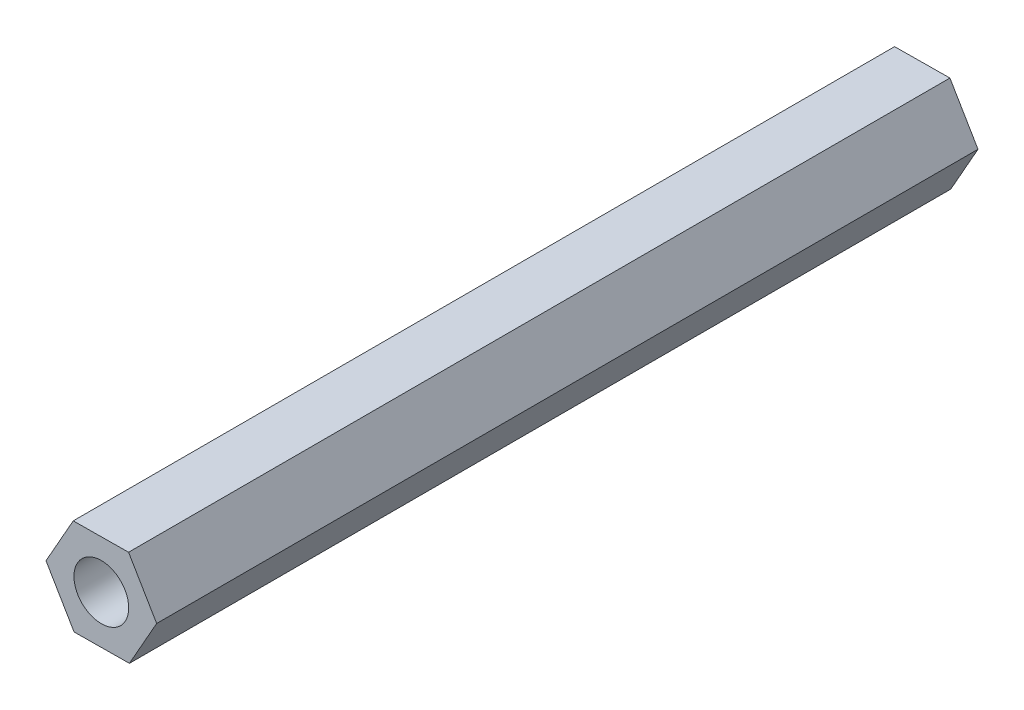
ISO-10303-21;
HEADER;
FILE_DESCRIPTION(('STEP AP214'),'2;1');
FILE_NAME('part.step','',(''),(''),'','','');
FILE_SCHEMA(('AUTOMOTIVE_DESIGN { 1 0 10303 214 1 1 1 1 }'));
ENDSEC;
DATA;
#1=APPLICATION_CONTEXT('core data for automotive mechanical design processes');
#2=APPLICATION_PROTOCOL_DEFINITION('international standard','automotive_design',2000,#1);
#3=PRODUCT_CONTEXT('',#1,'mechanical');
#4=PRODUCT('Part','Part','',(#3));
#5=PRODUCT_RELATED_PRODUCT_CATEGORY('part','',(#4));
#6=PRODUCT_DEFINITION_FORMATION('','',#4);
#7=PRODUCT_DEFINITION_CONTEXT('part definition',#1,'design');
#8=PRODUCT_DEFINITION('design','',#6,#7);
#9=PRODUCT_DEFINITION_SHAPE('','',#8);
#10=(LENGTH_UNIT() NAMED_UNIT(*) SI_UNIT(.MILLI.,.METRE.));
#11=(NAMED_UNIT(*) PLANE_ANGLE_UNIT() SI_UNIT($,.RADIAN.));
#12=(NAMED_UNIT(*) SI_UNIT($,.STERADIAN.) SOLID_ANGLE_UNIT());
#13=UNCERTAINTY_MEASURE_WITH_UNIT(LENGTH_MEASURE(1.E-05),#10,'distance_accuracy_value','');
#14=(GEOMETRIC_REPRESENTATION_CONTEXT(3) GLOBAL_UNCERTAINTY_ASSIGNED_CONTEXT((#13)) GLOBAL_UNIT_ASSIGNED_CONTEXT((#10,
#11,#12)) REPRESENTATION_CONTEXT('',''));
#15=CARTESIAN_POINT('',(0.,0.,0.));
#16=DIRECTION('',(0.,0.,1.));
#17=DIRECTION('',(1.,0.,0.));
#18=AXIS2_PLACEMENT_3D('',#15,#16,#17);
#19=CARTESIAN_POINT('',(0.,0.,60.));
#20=DIRECTION('',(0.,0.,1.));
#21=DIRECTION('',(1.,0.,0.));
#22=AXIS2_PLACEMENT_3D('',#19,#20,#21);
#23=PLANE('',#22);
#24=DIRECTION('',(0.999961257640527,0.00880245522430722,0.));
#25=VECTOR('',#24,1.);
#26=CARTESIAN_POINT('',(-1.98983906118775,-3.51765175136834,60.));
#27=LINE('',#26,#25);
#28=CARTESIAN_POINT('',(-1.98983906118775,-3.51765175136834,60.));
#29=VERTEX_POINT('',#28);
#30=CARTESIAN_POINT('',(2.05145624775792,-3.48207705211536,60.));
#31=VERTEX_POINT('',#30);
#32=EDGE_CURVE('E146',#29,#31,#27,.T.);
#33=ORIENTED_EDGE('',*,*,#32,.T.);
#34=DIRECTION('',(0.492357478980338,0.870393079529086,0.));
#35=VECTOR('',#34,1.);
#36=CARTESIAN_POINT('',(2.05145624775792,-3.48207705211536,60.));
#37=LINE('',#36,#35);
#38=CARTESIAN_POINT('',(4.04129530894568,0.0355746992529791,60.));
#39=VERTEX_POINT('',#38);
#40=EDGE_CURVE('E94',#31,#39,#37,.T.);
#41=ORIENTED_EDGE('',*,*,#40,.T.);
#42=DIRECTION('',(-0.507603778660189,0.861590624304779,0.));
#43=VECTOR('',#42,1.);
#44=CARTESIAN_POINT('',(4.04129530894568,0.0355746992529791,60.));
#45=LINE('',#44,#43);
#46=CARTESIAN_POINT('',(1.98983906118776,3.51765175136834,60.));
#47=VERTEX_POINT('',#46);
#48=EDGE_CURVE('E107',#39,#47,#45,.T.);
#49=ORIENTED_EDGE('',*,*,#48,.T.);
#50=DIRECTION('',(-0.999961257640527,-0.00880245522430723,0.));
#51=VECTOR('',#50,1.);
#52=CARTESIAN_POINT('',(1.98983906118776,3.51765175136834,60.));
#53=LINE('',#52,#51);
#54=CARTESIAN_POINT('',(-2.05145624775791,3.48207705211536,60.));
#55=VERTEX_POINT('',#54);
#56=EDGE_CURVE('E101',#47,#55,#53,.T.);
#57=ORIENTED_EDGE('',*,*,#56,.T.);
#58=DIRECTION('',(-0.492357478980338,-0.870393079529086,0.));
#59=VECTOR('',#58,1.);
#60=CARTESIAN_POINT('',(-2.05145624775791,3.48207705211536,60.));
#61=LINE('',#60,#59);
#62=CARTESIAN_POINT('',(-4.04129530894568,-0.0355746992529825,60.));
#63=VERTEX_POINT('',#62);
#64=EDGE_CURVE('E105',#55,#63,#61,.T.);
#65=ORIENTED_EDGE('',*,*,#64,.T.);
#66=DIRECTION('',(0.507603778660189,-0.861590624304779,0.));
#67=VECTOR('',#66,1.);
#68=CARTESIAN_POINT('',(-4.04129530894568,-0.0355746992529825,60.));
#69=LINE('',#68,#67);
#70=EDGE_CURVE('E57',#63,#29,#69,.T.);
#71=ORIENTED_EDGE('',*,*,#70,.T.);
#72=EDGE_LOOP('',(#33,#41,#49,#57,#65,#71));
#73=FACE_BOUND('',#72,.T.);
#74=CARTESIAN_POINT('',(0.,0.,60.));
#75=DIRECTION('',(0.,0.,1.));
#76=DIRECTION('',(1.,0.,0.));
#77=AXIS2_PLACEMENT_3D('',#74,#75,#76);
#78=CIRCLE('',#77,2.);
#79=CARTESIAN_POINT('',(2.,0.,60.));
#80=VERTEX_POINT('',#79);
#81=EDGE_CURVE('E134',#80,#80,#78,.T.);
#82=ORIENTED_EDGE('',*,*,#81,.F.);
#83=EDGE_LOOP('',(#82));
#84=FACE_BOUND('',#83,.T.);
#85=ADVANCED_FACE('F39',(#73,#84),#23,.T.);
#86=CARTESIAN_POINT('',(0.,0.,0.));
#87=DIRECTION('',(0.,0.,1.));
#88=DIRECTION('',(1.,0.,0.));
#89=AXIS2_PLACEMENT_3D('',#86,#87,#88);
#90=PLANE('',#89);
#91=DIRECTION('',(0.999961257640527,0.00880245522430722,0.));
#92=VECTOR('',#91,1.);
#93=CARTESIAN_POINT('',(-1.98983906118775,-3.51765175136834,0.));
#94=LINE('',#93,#92);
#95=CARTESIAN_POINT('',(-1.98983906118775,-3.51765175136834,0.));
#96=VERTEX_POINT('',#95);
#97=CARTESIAN_POINT('',(2.05145624775792,-3.48207705211536,0.));
#98=VERTEX_POINT('',#97);
#99=EDGE_CURVE('E129',#96,#98,#94,.T.);
#100=ORIENTED_EDGE('',*,*,#99,.F.);
#101=DIRECTION('',(0.507603778660189,-0.861590624304779,0.));
#102=VECTOR('',#101,1.);
#103=CARTESIAN_POINT('',(-4.04129530894568,-0.0355746992529825,0.));
#104=LINE('',#103,#102);
#105=CARTESIAN_POINT('',(-4.04129530894568,-0.0355746992529825,0.));
#106=VERTEX_POINT('',#105);
#107=EDGE_CURVE('E86',#106,#96,#104,.T.);
#108=ORIENTED_EDGE('',*,*,#107,.F.);
#109=DIRECTION('',(-0.492357478980338,-0.870393079529086,0.));
#110=VECTOR('',#109,1.);
#111=CARTESIAN_POINT('',(-2.05145624775791,3.48207705211536,0.));
#112=LINE('',#111,#110);
#113=CARTESIAN_POINT('',(-2.05145624775791,3.48207705211536,0.));
#114=VERTEX_POINT('',#113);
#115=EDGE_CURVE('E80',#114,#106,#112,.T.);
#116=ORIENTED_EDGE('',*,*,#115,.F.);
#117=DIRECTION('',(-0.999961257640527,-0.00880245522430723,0.));
#118=VECTOR('',#117,1.);
#119=CARTESIAN_POINT('',(1.98983906118776,3.51765175136834,0.));
#120=LINE('',#119,#118);
#121=CARTESIAN_POINT('',(1.98983906118776,3.51765175136834,0.));
#122=VERTEX_POINT('',#121);
#123=EDGE_CURVE('E116',#122,#114,#120,.T.);
#124=ORIENTED_EDGE('',*,*,#123,.F.);
#125=DIRECTION('',(-0.507603778660189,0.861590624304779,0.));
#126=VECTOR('',#125,1.);
#127=CARTESIAN_POINT('',(4.04129530894568,0.0355746992529791,0.));
#128=LINE('',#127,#126);
#129=CARTESIAN_POINT('',(4.04129530894568,0.0355746992529791,0.));
#130=VERTEX_POINT('',#129);
#131=EDGE_CURVE('E137',#130,#122,#128,.T.);
#132=ORIENTED_EDGE('',*,*,#131,.F.);
#133=DIRECTION('',(0.492357478980338,0.870393079529086,0.));
#134=VECTOR('',#133,1.);
#135=CARTESIAN_POINT('',(2.05145624775792,-3.48207705211536,0.));
#136=LINE('',#135,#134);
#137=EDGE_CURVE('E133',#98,#130,#136,.T.);
#138=ORIENTED_EDGE('',*,*,#137,.F.);
#139=EDGE_LOOP('',(#100,#108,#116,#124,#132,#138));
#140=FACE_BOUND('',#139,.T.);
#141=CARTESIAN_POINT('',(0.,0.,0.));
#142=DIRECTION('',(0.,0.,1.));
#143=DIRECTION('',(1.,0.,0.));
#144=AXIS2_PLACEMENT_3D('',#141,#142,#143);
#145=CIRCLE('',#144,2.);
#146=CARTESIAN_POINT('',(2.,0.,0.));
#147=VERTEX_POINT('',#146);
#148=EDGE_CURVE('E243',#147,#147,#145,.T.);
#149=ORIENTED_EDGE('',*,*,#148,.T.);
#150=EDGE_LOOP('',(#149));
#151=FACE_BOUND('',#150,.T.);
#152=ADVANCED_FACE('F159',(#140,#151),#90,.F.);
#153=CARTESIAN_POINT('',(-1.98983906118775,-3.51765175136834,60.));
#154=DIRECTION('',(-0.00880245522430722,0.999961257640527,0.));
#155=DIRECTION('',(-0.999961257640527,-0.00880245522430722,0.));
#156=AXIS2_PLACEMENT_3D('',#153,#154,#155);
#157=PLANE('',#156);
#158=ORIENTED_EDGE('',*,*,#99,.T.);
#159=DIRECTION('',(0.,0.,-1.));
#160=VECTOR('',#159,1.);
#161=CARTESIAN_POINT('',(2.05145624775792,-3.48207705211536,60.));
#162=LINE('',#161,#160);
#163=EDGE_CURVE('E11',#31,#98,#162,.T.);
#164=ORIENTED_EDGE('',*,*,#163,.F.);
#165=ORIENTED_EDGE('',*,*,#32,.F.);
#166=DIRECTION('',(0.,0.,-1.));
#167=VECTOR('',#166,1.);
#168=CARTESIAN_POINT('',(-1.98983906118775,-3.51765175136834,60.));
#169=LINE('',#168,#167);
#170=EDGE_CURVE('E125',#29,#96,#169,.T.);
#171=ORIENTED_EDGE('',*,*,#170,.T.);
#172=EDGE_LOOP('',(#158,#164,#165,#171));
#173=FACE_BOUND('',#172,.T.);
#174=ADVANCED_FACE('F41',(#173),#157,.F.);
#175=CARTESIAN_POINT('',(2.05145624775792,-3.48207705211536,60.));
#176=DIRECTION('',(-0.870393079529086,0.492357478980338,0.));
#177=DIRECTION('',(-0.492357478980338,-0.870393079529086,0.));
#178=AXIS2_PLACEMENT_3D('',#175,#176,#177);
#179=PLANE('',#178);
#180=ORIENTED_EDGE('',*,*,#137,.T.);
#181=DIRECTION('',(0.,0.,-1.));
#182=VECTOR('',#181,1.);
#183=CARTESIAN_POINT('',(4.04129530894568,0.0355746992529791,60.));
#184=LINE('',#183,#182);
#185=EDGE_CURVE('E49',#39,#130,#184,.T.);
#186=ORIENTED_EDGE('',*,*,#185,.F.);
#187=ORIENTED_EDGE('',*,*,#40,.F.);
#188=ORIENTED_EDGE('',*,*,#163,.T.);
#189=EDGE_LOOP('',(#180,#186,#187,#188));
#190=FACE_BOUND('',#189,.T.);
#191=ADVANCED_FACE('F184',(#190),#179,.F.);
#192=CARTESIAN_POINT('',(4.04129530894568,0.0355746992529791,60.));
#193=DIRECTION('',(-0.861590624304779,-0.507603778660189,0.));
#194=DIRECTION('',(0.507603778660189,-0.861590624304779,0.));
#195=AXIS2_PLACEMENT_3D('',#192,#193,#194);
#196=PLANE('',#195);
#197=ORIENTED_EDGE('',*,*,#131,.T.);
#198=DIRECTION('',(0.,0.,-1.));
#199=VECTOR('',#198,1.);
#200=CARTESIAN_POINT('',(1.98983906118776,3.51765175136834,60.));
#201=LINE('',#200,#199);
#202=EDGE_CURVE('E118',#47,#122,#201,.T.);
#203=ORIENTED_EDGE('',*,*,#202,.F.);
#204=ORIENTED_EDGE('',*,*,#48,.F.);
#205=ORIENTED_EDGE('',*,*,#185,.T.);
#206=EDGE_LOOP('',(#197,#203,#204,#205));
#207=FACE_BOUND('',#206,.T.);
#208=ADVANCED_FACE('F156',(#207),#196,.F.);
#209=CARTESIAN_POINT('',(1.98983906118776,3.51765175136834,60.));
#210=DIRECTION('',(0.00880245522430723,-0.999961257640527,0.));
#211=DIRECTION('',(0.999961257640527,0.00880245522430723,0.));
#212=AXIS2_PLACEMENT_3D('',#209,#210,#211);
#213=PLANE('',#212);
#214=ORIENTED_EDGE('',*,*,#123,.T.);
#215=DIRECTION('',(0.,0.,-1.));
#216=VECTOR('',#215,1.);
#217=CARTESIAN_POINT('',(-2.05145624775791,3.48207705211536,60.));
#218=LINE('',#217,#216);
#219=EDGE_CURVE('E113',#55,#114,#218,.T.);
#220=ORIENTED_EDGE('',*,*,#219,.F.);
#221=ORIENTED_EDGE('',*,*,#56,.F.);
#222=ORIENTED_EDGE('',*,*,#202,.T.);
#223=EDGE_LOOP('',(#214,#220,#221,#222));
#224=FACE_BOUND('',#223,.T.);
#225=ADVANCED_FACE('F114',(#224),#213,.F.);
#226=CARTESIAN_POINT('',(-2.05145624775791,3.48207705211536,60.));
#227=DIRECTION('',(0.870393079529086,-0.492357478980338,0.));
#228=DIRECTION('',(0.492357478980338,0.870393079529086,0.));
#229=AXIS2_PLACEMENT_3D('',#226,#227,#228);
#230=PLANE('',#229);
#231=ORIENTED_EDGE('',*,*,#115,.T.);
#232=DIRECTION('',(0.,0.,-1.));
#233=VECTOR('',#232,1.);
#234=CARTESIAN_POINT('',(-4.04129530894568,-0.0355746992529825,60.));
#235=LINE('',#234,#233);
#236=EDGE_CURVE('E119',#63,#106,#235,.T.);
#237=ORIENTED_EDGE('',*,*,#236,.F.);
#238=ORIENTED_EDGE('',*,*,#64,.F.);
#239=ORIENTED_EDGE('',*,*,#219,.T.);
#240=EDGE_LOOP('',(#231,#237,#238,#239));
#241=FACE_BOUND('',#240,.T.);
#242=ADVANCED_FACE('F121',(#241),#230,.F.);
#243=CARTESIAN_POINT('',(-4.04129530894568,-0.0355746992529825,60.));
#244=DIRECTION('',(0.861590624304779,0.507603778660189,0.));
#245=DIRECTION('',(-0.507603778660189,0.861590624304779,0.));
#246=AXIS2_PLACEMENT_3D('',#243,#244,#245);
#247=PLANE('',#246);
#248=ORIENTED_EDGE('',*,*,#107,.T.);
#249=ORIENTED_EDGE('',*,*,#170,.F.);
#250=ORIENTED_EDGE('',*,*,#70,.F.);
#251=ORIENTED_EDGE('',*,*,#236,.T.);
#252=EDGE_LOOP('',(#248,#249,#250,#251));
#253=FACE_BOUND('',#252,.T.);
#254=ADVANCED_FACE('F164',(#253),#247,.F.);
#255=CARTESIAN_POINT('',(0.,0.,60.));
#256=DIRECTION('',(0.,0.,-1.));
#257=DIRECTION('',(-1.,0.,0.));
#258=AXIS2_PLACEMENT_3D('',#255,#256,#257);
#259=CYLINDRICAL_SURFACE('',#258,2.);
#260=ORIENTED_EDGE('',*,*,#81,.T.);
#261=EDGE_LOOP('',(#260));
#262=FACE_BOUND('',#261,.T.);
#263=ORIENTED_EDGE('',*,*,#148,.F.);
#264=EDGE_LOOP('',(#263));
#265=FACE_BOUND('',#264,.T.);
#266=ADVANCED_FACE('F166',(#262,#265),#259,.F.);
#267=CLOSED_SHELL('',(#85,#152,#174,#191,#208,#225,#242,#254,#266));
#268=MANIFOLD_SOLID_BREP('B2',#267);
#269=ADVANCED_BREP_SHAPE_REPRESENTATION('',(#18,#268),#14);
#270=SHAPE_DEFINITION_REPRESENTATION(#9,#269);
ENDSEC;
END-ISO-10303-21;
